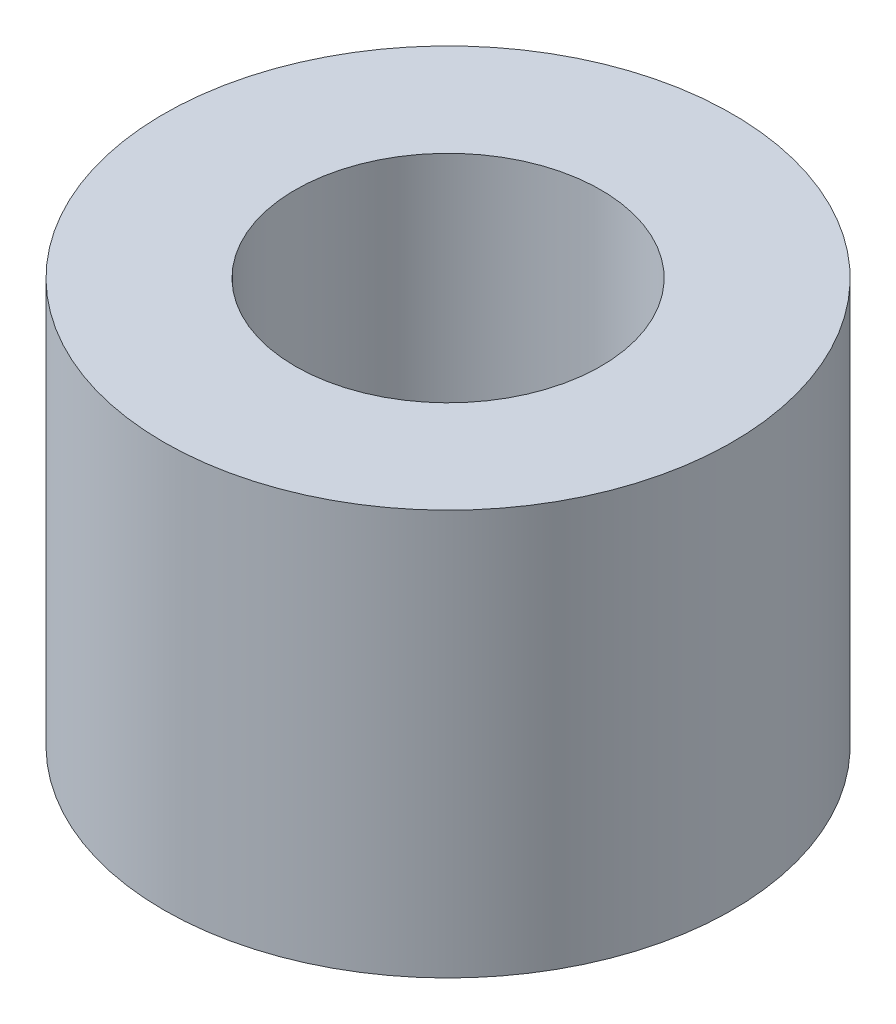
ISO-10303-21;
HEADER;
FILE_DESCRIPTION(('STEP AP214'),'2;1');
FILE_NAME('part.step','',(''),(''),'','','');
FILE_SCHEMA(('AUTOMOTIVE_DESIGN { 1 0 10303 214 1 1 1 1 }'));
ENDSEC;
DATA;
#1=APPLICATION_CONTEXT('core data for automotive mechanical design processes');
#2=APPLICATION_PROTOCOL_DEFINITION('international standard','automotive_design',2000,#1);
#3=PRODUCT_CONTEXT('',#1,'mechanical');
#4=PRODUCT('Part','Part','',(#3));
#5=PRODUCT_RELATED_PRODUCT_CATEGORY('part','',(#4));
#6=PRODUCT_DEFINITION_FORMATION('','',#4);
#7=PRODUCT_DEFINITION_CONTEXT('part definition',#1,'design');
#8=PRODUCT_DEFINITION('design','',#6,#7);
#9=PRODUCT_DEFINITION_SHAPE('','',#8);
#10=(LENGTH_UNIT() NAMED_UNIT(*) SI_UNIT(.MILLI.,.METRE.));
#11=(NAMED_UNIT(*) PLANE_ANGLE_UNIT() SI_UNIT($,.RADIAN.));
#12=(NAMED_UNIT(*) SI_UNIT($,.STERADIAN.) SOLID_ANGLE_UNIT());
#13=UNCERTAINTY_MEASURE_WITH_UNIT(LENGTH_MEASURE(1.E-05),#10,'distance_accuracy_value','');
#14=(GEOMETRIC_REPRESENTATION_CONTEXT(3) GLOBAL_UNCERTAINTY_ASSIGNED_CONTEXT((#13)) GLOBAL_UNIT_ASSIGNED_CONTEXT((#10,
#11,#12)) REPRESENTATION_CONTEXT('',''));
#15=CARTESIAN_POINT('',(0.,0.,0.));
#16=DIRECTION('',(0.,0.,1.));
#17=DIRECTION('',(1.,0.,0.));
#18=AXIS2_PLACEMENT_3D('',#15,#16,#17);
#19=CARTESIAN_POINT('',(0.,12.075,13.44));
#20=DIRECTION('',(0.,1.,0.));
#21=DIRECTION('',(0.,0.,1.));
#22=AXIS2_PLACEMENT_3D('',#19,#20,#21);
#23=PLANE('',#22);
#24=CARTESIAN_POINT('',(0.,12.075,13.44));
#25=DIRECTION('',(0.,1.,0.));
#26=DIRECTION('',(0.,0.,1.));
#27=AXIS2_PLACEMENT_3D('',#24,#25,#26);
#28=CIRCLE('',#27,4.);
#29=CARTESIAN_POINT('',(0.,12.075,17.44));
#30=VERTEX_POINT('',#29);
#31=EDGE_CURVE('E10',#30,#30,#28,.T.);
#32=ORIENTED_EDGE('',*,*,#31,.T.);
#33=EDGE_LOOP('',(#32));
#34=FACE_BOUND('',#33,.T.);
#35=CARTESIAN_POINT('',(0.,12.075,13.44));
#36=DIRECTION('',(0.,1.,0.));
#37=DIRECTION('',(0.,0.,1.));
#38=AXIS2_PLACEMENT_3D('',#35,#36,#37);
#39=CIRCLE('',#38,2.15);
#40=CARTESIAN_POINT('',(0.,12.075,15.59));
#41=VERTEX_POINT('',#40);
#42=EDGE_CURVE('E49',#41,#41,#39,.T.);
#43=ORIENTED_EDGE('',*,*,#42,.F.);
#44=EDGE_LOOP('',(#43));
#45=FACE_BOUND('',#44,.T.);
#46=ADVANCED_FACE('F39',(#34,#45),#23,.T.);
#47=CARTESIAN_POINT('',(0.,6.375,13.44));
#48=DIRECTION('',(0.,1.,0.));
#49=DIRECTION('',(0.,0.,1.));
#50=AXIS2_PLACEMENT_3D('',#47,#48,#49);
#51=PLANE('',#50);
#52=CARTESIAN_POINT('',(0.,6.375,13.44));
#53=DIRECTION('',(0.,1.,0.));
#54=DIRECTION('',(0.,0.,1.));
#55=AXIS2_PLACEMENT_3D('',#52,#53,#54);
#56=CIRCLE('',#55,4.);
#57=CARTESIAN_POINT('',(0.,6.375,17.44));
#58=VERTEX_POINT('',#57);
#59=EDGE_CURVE('E43',#58,#58,#56,.T.);
#60=ORIENTED_EDGE('',*,*,#59,.F.);
#61=EDGE_LOOP('',(#60));
#62=FACE_BOUND('',#61,.T.);
#63=CARTESIAN_POINT('',(0.,6.375,13.44));
#64=DIRECTION('',(0.,1.,0.));
#65=DIRECTION('',(0.,0.,1.));
#66=AXIS2_PLACEMENT_3D('',#63,#64,#65);
#67=CIRCLE('',#66,2.15);
#68=CARTESIAN_POINT('',(0.,6.375,15.59));
#69=VERTEX_POINT('',#68);
#70=EDGE_CURVE('E55',#69,#69,#67,.T.);
#71=ORIENTED_EDGE('',*,*,#70,.T.);
#72=EDGE_LOOP('',(#71));
#73=FACE_BOUND('',#72,.T.);
#74=ADVANCED_FACE('F65',(#62,#73),#51,.F.);
#75=CARTESIAN_POINT('',(0.,12.075,13.44));
#76=DIRECTION('',(0.,-1.,0.));
#77=DIRECTION('',(0.,0.,-1.));
#78=AXIS2_PLACEMENT_3D('',#75,#76,#77);
#79=CYLINDRICAL_SURFACE('',#78,4.);
#80=ORIENTED_EDGE('',*,*,#31,.F.);
#81=EDGE_LOOP('',(#80));
#82=FACE_BOUND('',#81,.T.);
#83=ORIENTED_EDGE('',*,*,#59,.T.);
#84=EDGE_LOOP('',(#83));
#85=FACE_BOUND('',#84,.T.);
#86=ADVANCED_FACE('F41',(#82,#85),#79,.T.);
#87=CARTESIAN_POINT('',(0.,12.075,13.44));
#88=DIRECTION('',(0.,-1.,0.));
#89=DIRECTION('',(0.,0.,-1.));
#90=AXIS2_PLACEMENT_3D('',#87,#88,#89);
#91=CYLINDRICAL_SURFACE('',#90,2.15);
#92=ORIENTED_EDGE('',*,*,#42,.T.);
#93=EDGE_LOOP('',(#92));
#94=FACE_BOUND('',#93,.T.);
#95=ORIENTED_EDGE('',*,*,#70,.F.);
#96=EDGE_LOOP('',(#95));
#97=FACE_BOUND('',#96,.T.);
#98=ADVANCED_FACE('F59',(#94,#97),#91,.F.);
#99=CLOSED_SHELL('',(#46,#74,#86,#98));
#100=MANIFOLD_SOLID_BREP('B2',#99);
#101=ADVANCED_BREP_SHAPE_REPRESENTATION('',(#18,#100),#14);
#102=SHAPE_DEFINITION_REPRESENTATION(#9,#101);
ENDSEC;
END-ISO-10303-21;
